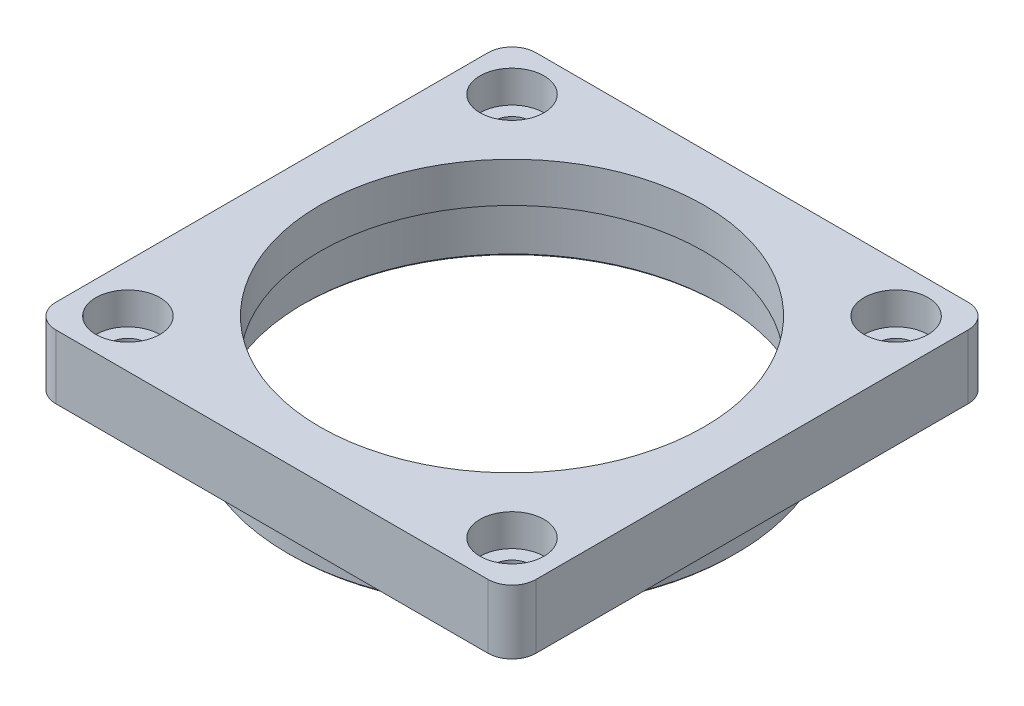
ISO-10303-21;
HEADER;
FILE_DESCRIPTION(('STEP AP214'),'2;1');
FILE_NAME('part.step','',(''),(''),'','','');
FILE_SCHEMA(('AUTOMOTIVE_DESIGN { 1 0 10303 214 1 1 1 1 }'));
ENDSEC;
DATA;
#1=APPLICATION_CONTEXT('core data for automotive mechanical design processes');
#2=APPLICATION_PROTOCOL_DEFINITION('international standard','automotive_design',2000,#1);
#3=PRODUCT_CONTEXT('',#1,'mechanical');
#4=PRODUCT('Part','Part','',(#3));
#5=PRODUCT_RELATED_PRODUCT_CATEGORY('part','',(#4));
#6=PRODUCT_DEFINITION_FORMATION('','',#4);
#7=PRODUCT_DEFINITION_CONTEXT('part definition',#1,'design');
#8=PRODUCT_DEFINITION('design','',#6,#7);
#9=PRODUCT_DEFINITION_SHAPE('','',#8);
#10=(LENGTH_UNIT() NAMED_UNIT(*) SI_UNIT(.MILLI.,.METRE.));
#11=(NAMED_UNIT(*) PLANE_ANGLE_UNIT() SI_UNIT($,.RADIAN.));
#12=(NAMED_UNIT(*) SI_UNIT($,.STERADIAN.) SOLID_ANGLE_UNIT());
#13=UNCERTAINTY_MEASURE_WITH_UNIT(LENGTH_MEASURE(1.E-05),#10,'distance_accuracy_value','');
#14=(GEOMETRIC_REPRESENTATION_CONTEXT(3) GLOBAL_UNCERTAINTY_ASSIGNED_CONTEXT((#13)) GLOBAL_UNIT_ASSIGNED_CONTEXT((#10,
#11,#12)) REPRESENTATION_CONTEXT('',''));
#15=CARTESIAN_POINT('',(0.,0.,0.));
#16=DIRECTION('',(0.,0.,1.));
#17=DIRECTION('',(1.,0.,0.));
#18=AXIS2_PLACEMENT_3D('',#15,#16,#17);
#19=CARTESIAN_POINT('',(-24.,8.,23.9999999999992));
#20=DIRECTION('',(0.,-1.,0.));
#21=DIRECTION('',(0.,0.,-1.));
#22=AXIS2_PLACEMENT_3D('',#19,#20,#21);
#23=CYLINDRICAL_SURFACE('',#22,2.24999999999989);
#24=CARTESIAN_POINT('',(-24.,0.,23.9999999999992));
#25=DIRECTION('',(0.,-1.,0.));
#26=DIRECTION('',(0.,0.,-1.));
#27=AXIS2_PLACEMENT_3D('',#24,#25,#26);
#28=CIRCLE('',#27,2.24999999999989);
#29=CARTESIAN_POINT('',(-24.,0.,21.7499999999993));
#30=VERTEX_POINT('',#29);
#31=EDGE_CURVE('E231',#30,#30,#28,.T.);
#32=ORIENTED_EDGE('',*,*,#31,.T.);
#33=EDGE_LOOP('',(#32));
#34=FACE_BOUND('',#33,.T.);
#35=CARTESIAN_POINT('',(-24.,4.,23.9999999999992));
#36=DIRECTION('',(0.,1.,0.));
#37=DIRECTION('',(0.,0.,1.));
#38=AXIS2_PLACEMENT_3D('',#35,#36,#37);
#39=CIRCLE('',#38,2.24999999999989);
#40=CARTESIAN_POINT('',(-24.,4.,26.2499999999991));
#41=VERTEX_POINT('',#40);
#42=EDGE_CURVE('E185',#41,#41,#39,.F.);
#43=ORIENTED_EDGE('',*,*,#42,.F.);
#44=EDGE_LOOP('',(#43));
#45=FACE_BOUND('',#44,.T.);
#46=ADVANCED_FACE('F41',(#34,#45),#23,.F.);
#47=CARTESIAN_POINT('',(24.,8.,24.0000000000012));
#48=DIRECTION('',(0.,-1.,0.));
#49=DIRECTION('',(0.,0.,-1.));
#50=AXIS2_PLACEMENT_3D('',#47,#48,#49);
#51=CYLINDRICAL_SURFACE('',#50,2.25);
#52=CARTESIAN_POINT('',(24.,0.,24.0000000000012));
#53=DIRECTION('',(0.,-1.,0.));
#54=DIRECTION('',(0.,0.,-1.));
#55=AXIS2_PLACEMENT_3D('',#52,#53,#54);
#56=CIRCLE('',#55,2.25);
#57=CARTESIAN_POINT('',(24.,0.,21.7500000000012));
#58=VERTEX_POINT('',#57);
#59=EDGE_CURVE('E228',#58,#58,#56,.T.);
#60=ORIENTED_EDGE('',*,*,#59,.T.);
#61=EDGE_LOOP('',(#60));
#62=FACE_BOUND('',#61,.T.);
#63=CARTESIAN_POINT('',(24.,4.,24.0000000000012));
#64=DIRECTION('',(0.,1.,0.));
#65=DIRECTION('',(0.,0.,1.));
#66=AXIS2_PLACEMENT_3D('',#63,#64,#65);
#67=CIRCLE('',#66,2.25);
#68=CARTESIAN_POINT('',(24.,4.,26.2500000000012));
#69=VERTEX_POINT('',#68);
#70=EDGE_CURVE('E182',#69,#69,#67,.F.);
#71=ORIENTED_EDGE('',*,*,#70,.F.);
#72=EDGE_LOOP('',(#71));
#73=FACE_BOUND('',#72,.T.);
#74=ADVANCED_FACE('F273',(#62,#73),#51,.F.);
#75=CARTESIAN_POINT('',(24.0000000000002,8.,-23.9999999999988));
#76=DIRECTION('',(0.,-1.,0.));
#77=DIRECTION('',(0.,0.,-1.));
#78=AXIS2_PLACEMENT_3D('',#75,#76,#77);
#79=CYLINDRICAL_SURFACE('',#78,2.25);
#80=CARTESIAN_POINT('',(24.0000000000002,0.,-23.9999999999988));
#81=DIRECTION('',(0.,-1.,0.));
#82=DIRECTION('',(0.,0.,-1.));
#83=AXIS2_PLACEMENT_3D('',#80,#81,#82);
#84=CIRCLE('',#83,2.25);
#85=CARTESIAN_POINT('',(24.0000000000002,0.,-26.2499999999988));
#86=VERTEX_POINT('',#85);
#87=EDGE_CURVE('E232',#86,#86,#84,.T.);
#88=ORIENTED_EDGE('',*,*,#87,.T.);
#89=EDGE_LOOP('',(#88));
#90=FACE_BOUND('',#89,.T.);
#91=CARTESIAN_POINT('',(24.0000000000002,4.,-23.9999999999988));
#92=DIRECTION('',(0.,1.,0.));
#93=DIRECTION('',(0.,0.,1.));
#94=AXIS2_PLACEMENT_3D('',#91,#92,#93);
#95=CIRCLE('',#94,2.25);
#96=CARTESIAN_POINT('',(24.0000000000002,4.,-21.7499999999988));
#97=VERTEX_POINT('',#96);
#98=EDGE_CURVE('E178',#97,#97,#95,.F.);
#99=ORIENTED_EDGE('',*,*,#98,.F.);
#100=EDGE_LOOP('',(#99));
#101=FACE_BOUND('',#100,.T.);
#102=ADVANCED_FACE('F279',(#90,#101),#79,.F.);
#103=CARTESIAN_POINT('',(-23.9999999999998,8.,-24.0000000000005));
#104=DIRECTION('',(0.,-1.,0.));
#105=DIRECTION('',(0.,0.,-1.));
#106=AXIS2_PLACEMENT_3D('',#103,#104,#105);
#107=CYLINDRICAL_SURFACE('',#106,2.25);
#108=CARTESIAN_POINT('',(-23.9999999999998,0.,-24.0000000000005));
#109=DIRECTION('',(0.,-1.,0.));
#110=DIRECTION('',(0.,0.,-1.));
#111=AXIS2_PLACEMENT_3D('',#108,#109,#110);
#112=CIRCLE('',#111,2.25);
#113=CARTESIAN_POINT('',(-23.9999999999998,0.,-26.2500000000005));
#114=VERTEX_POINT('',#113);
#115=EDGE_CURVE('E173',#114,#114,#112,.T.);
#116=ORIENTED_EDGE('',*,*,#115,.T.);
#117=EDGE_LOOP('',(#116));
#118=FACE_BOUND('',#117,.T.);
#119=CARTESIAN_POINT('',(-23.9999999999998,4.,-24.0000000000005));
#120=DIRECTION('',(0.,1.,0.));
#121=DIRECTION('',(0.,0.,1.));
#122=AXIS2_PLACEMENT_3D('',#119,#120,#121);
#123=CIRCLE('',#122,2.25);
#124=CARTESIAN_POINT('',(-23.9999999999998,4.,-21.7500000000005));
#125=VERTEX_POINT('',#124);
#126=EDGE_CURVE('E175',#125,#125,#123,.F.);
#127=ORIENTED_EDGE('',*,*,#126,.F.);
#128=EDGE_LOOP('',(#127));
#129=FACE_BOUND('',#128,.T.);
#130=ADVANCED_FACE('F284',(#118,#129),#107,.F.);
#131=CARTESIAN_POINT('',(0.,8.,0.));
#132=DIRECTION('',(0.,-1.,0.));
#133=DIRECTION('',(0.,0.,-1.));
#134=AXIS2_PLACEMENT_3D('',#131,#132,#133);
#135=CYLINDRICAL_SURFACE('',#134,24.);
#136=CARTESIAN_POINT('',(0.,8.,0.));
#137=DIRECTION('',(0.,1.,0.));
#138=DIRECTION('',(0.,0.,1.));
#139=AXIS2_PLACEMENT_3D('',#136,#137,#138);
#140=CIRCLE('',#139,24.);
#141=CARTESIAN_POINT('',(0.,8.,24.));
#142=VERTEX_POINT('',#141);
#143=EDGE_CURVE('E239',#142,#142,#140,.T.);
#144=ORIENTED_EDGE('',*,*,#143,.T.);
#145=EDGE_LOOP('',(#144));
#146=FACE_BOUND('',#145,.T.);
#147=CARTESIAN_POINT('',(0.,3.,0.));
#148=DIRECTION('',(0.,-1.,0.));
#149=DIRECTION('',(0.,0.,-1.));
#150=AXIS2_PLACEMENT_3D('',#147,#148,#149);
#151=CIRCLE('',#150,24.);
#152=CARTESIAN_POINT('',(0.,3.,-24.));
#153=VERTEX_POINT('',#152);
#154=EDGE_CURVE('E170',#153,#153,#151,.T.);
#155=ORIENTED_EDGE('',*,*,#154,.T.);
#156=EDGE_LOOP('',(#155));
#157=FACE_BOUND('',#156,.T.);
#158=ADVANCED_FACE('F289',(#146,#157),#135,.F.);
#159=CARTESIAN_POINT('',(0.,8.,0.));
#160=DIRECTION('',(0.,1.,0.));
#161=DIRECTION('',(0.,0.,1.));
#162=AXIS2_PLACEMENT_3D('',#159,#160,#161);
#163=PLANE('',#162);
#164=CARTESIAN_POINT('',(-23.9999999999987,8.,23.9999999999995));
#165=DIRECTION('',(0.,1.,0.));
#166=DIRECTION('',(0.,0.,1.));
#167=AXIS2_PLACEMENT_3D('',#164,#165,#166);
#168=CIRCLE('',#167,4.);
#169=CARTESIAN_POINT('',(-23.9999999999987,8.,27.9999999999995));
#170=VERTEX_POINT('',#169);
#171=EDGE_CURVE('E380',#170,#170,#168,.T.);
#172=ORIENTED_EDGE('',*,*,#171,.F.);
#173=EDGE_LOOP('',(#172));
#174=FACE_BOUND('',#173,.T.);
#175=CARTESIAN_POINT('',(24.0000000000013,8.,23.9999999999995));
#176=DIRECTION('',(0.,1.,0.));
#177=DIRECTION('',(0.,0.,1.));
#178=AXIS2_PLACEMENT_3D('',#175,#176,#177);
#179=CIRCLE('',#178,4.);
#180=CARTESIAN_POINT('',(24.0000000000013,8.,27.9999999999995));
#181=VERTEX_POINT('',#180);
#182=EDGE_CURVE('E374',#181,#181,#179,.T.);
#183=ORIENTED_EDGE('',*,*,#182,.F.);
#184=EDGE_LOOP('',(#183));
#185=FACE_BOUND('',#184,.T.);
#186=CARTESIAN_POINT('',(24.0000000000002,8.,-24.0000000000005));
#187=DIRECTION('',(0.,1.,0.));
#188=DIRECTION('',(0.,0.,1.));
#189=AXIS2_PLACEMENT_3D('',#186,#187,#188);
#190=CIRCLE('',#189,4.);
#191=CARTESIAN_POINT('',(24.0000000000002,8.,-20.0000000000005));
#192=VERTEX_POINT('',#191);
#193=EDGE_CURVE('E366',#192,#192,#190,.T.);
#194=ORIENTED_EDGE('',*,*,#193,.F.);
#195=EDGE_LOOP('',(#194));
#196=FACE_BOUND('',#195,.T.);
#197=CARTESIAN_POINT('',(-23.9999999999998,8.,-24.0000000000005));
#198=DIRECTION('',(0.,1.,0.));
#199=DIRECTION('',(0.,0.,1.));
#200=AXIS2_PLACEMENT_3D('',#197,#198,#199);
#201=CIRCLE('',#200,4.);
#202=CARTESIAN_POINT('',(-23.9999999999998,8.,-20.0000000000005));
#203=VERTEX_POINT('',#202);
#204=EDGE_CURVE('E226',#203,#203,#201,.T.);
#205=ORIENTED_EDGE('',*,*,#204,.F.);
#206=EDGE_LOOP('',(#205));
#207=FACE_BOUND('',#206,.T.);
#208=DIRECTION('',(0.,0.,1.));
#209=VECTOR('',#208,1.);
#210=CARTESIAN_POINT('',(-30.,8.,-30.));
#211=LINE('',#210,#209);
#212=CARTESIAN_POINT('',(-30.,8.,-27.));
#213=VERTEX_POINT('',#212);
#214=CARTESIAN_POINT('',(-30.,8.,27.));
#215=VERTEX_POINT('',#214);
#216=EDGE_CURVE('E246',#213,#215,#211,.T.);
#217=ORIENTED_EDGE('',*,*,#216,.T.);
#218=CARTESIAN_POINT('',(-27.,8.,27.));
#219=DIRECTION('',(0.,1.,0.));
#220=DIRECTION('',(0.,0.,1.));
#221=AXIS2_PLACEMENT_3D('',#218,#219,#220);
#222=CIRCLE('',#221,3.);
#223=CARTESIAN_POINT('',(-27.,8.,30.));
#224=VERTEX_POINT('',#223);
#225=EDGE_CURVE('E158',#215,#224,#222,.T.);
#226=ORIENTED_EDGE('',*,*,#225,.T.);
#227=DIRECTION('',(1.,0.,0.));
#228=VECTOR('',#227,1.);
#229=CARTESIAN_POINT('',(-30.,8.,30.));
#230=LINE('',#229,#228);
#231=CARTESIAN_POINT('',(27.,8.,30.));
#232=VERTEX_POINT('',#231);
#233=EDGE_CURVE('E129',#224,#232,#230,.T.);
#234=ORIENTED_EDGE('',*,*,#233,.T.);
#235=CARTESIAN_POINT('',(27.,8.,27.));
#236=DIRECTION('',(0.,1.,0.));
#237=DIRECTION('',(0.,0.,1.));
#238=AXIS2_PLACEMENT_3D('',#235,#236,#237);
#239=CIRCLE('',#238,3.);
#240=CARTESIAN_POINT('',(30.,8.,27.));
#241=VERTEX_POINT('',#240);
#242=EDGE_CURVE('E153',#232,#241,#239,.T.);
#243=ORIENTED_EDGE('',*,*,#242,.T.);
#244=DIRECTION('',(0.,0.,-1.));
#245=VECTOR('',#244,1.);
#246=CARTESIAN_POINT('',(30.,8.,-30.));
#247=LINE('',#246,#245);
#248=CARTESIAN_POINT('',(30.,8.,-27.));
#249=VERTEX_POINT('',#248);
#250=EDGE_CURVE('E135',#241,#249,#247,.T.);
#251=ORIENTED_EDGE('',*,*,#250,.T.);
#252=CARTESIAN_POINT('',(27.,8.,-27.));
#253=DIRECTION('',(0.,1.,0.));
#254=DIRECTION('',(0.,0.,1.));
#255=AXIS2_PLACEMENT_3D('',#252,#253,#254);
#256=CIRCLE('',#255,3.);
#257=CARTESIAN_POINT('',(27.,8.,-30.));
#258=VERTEX_POINT('',#257);
#259=EDGE_CURVE('E64',#249,#258,#256,.T.);
#260=ORIENTED_EDGE('',*,*,#259,.T.);
#261=DIRECTION('',(-1.,0.,0.));
#262=VECTOR('',#261,1.);
#263=CARTESIAN_POINT('',(-30.,8.,-30.));
#264=LINE('',#263,#262);
#265=CARTESIAN_POINT('',(-27.,8.,-30.));
#266=VERTEX_POINT('',#265);
#267=EDGE_CURVE('E138',#258,#266,#264,.T.);
#268=ORIENTED_EDGE('',*,*,#267,.T.);
#269=CARTESIAN_POINT('',(-27.,8.,-27.));
#270=DIRECTION('',(0.,1.,0.));
#271=DIRECTION('',(0.,0.,1.));
#272=AXIS2_PLACEMENT_3D('',#269,#270,#271);
#273=CIRCLE('',#272,3.);
#274=EDGE_CURVE('E156',#266,#213,#273,.T.);
#275=ORIENTED_EDGE('',*,*,#274,.T.);
#276=EDGE_LOOP('',(#217,#226,#234,#243,#251,#260,#268,#275));
#277=FACE_BOUND('',#276,.T.);
#278=ORIENTED_EDGE('',*,*,#143,.F.);
#279=EDGE_LOOP('',(#278));
#280=FACE_BOUND('',#279,.T.);
#281=ADVANCED_FACE('F259',(#174,#185,#196,#207,#277,#280),#163,.T.);
#282=CARTESIAN_POINT('',(0.,0.,0.));
#283=DIRECTION('',(0.,1.,0.));
#284=DIRECTION('',(0.,0.,1.));
#285=AXIS2_PLACEMENT_3D('',#282,#283,#284);
#286=PLANE('',#285);
#287=ORIENTED_EDGE('',*,*,#115,.F.);
#288=EDGE_LOOP('',(#287));
#289=FACE_BOUND('',#288,.T.);
#290=ORIENTED_EDGE('',*,*,#87,.F.);
#291=EDGE_LOOP('',(#290));
#292=FACE_BOUND('',#291,.T.);
#293=ORIENTED_EDGE('',*,*,#59,.F.);
#294=EDGE_LOOP('',(#293));
#295=FACE_BOUND('',#294,.T.);
#296=ORIENTED_EDGE('',*,*,#31,.F.);
#297=EDGE_LOOP('',(#296));
#298=FACE_BOUND('',#297,.T.);
#299=CARTESIAN_POINT('',(0.,0.,0.));
#300=DIRECTION('',(0.,-1.,0.));
#301=DIRECTION('',(0.,0.,-1.));
#302=AXIS2_PLACEMENT_3D('',#299,#300,#301);
#303=CIRCLE('',#302,28.);
#304=CARTESIAN_POINT('',(0.,0.,-28.));
#305=VERTEX_POINT('',#304);
#306=EDGE_CURVE('E144',#305,#305,#303,.T.);
#307=ORIENTED_EDGE('',*,*,#306,.F.);
#308=EDGE_LOOP('',(#307));
#309=FACE_BOUND('',#308,.T.);
#310=DIRECTION('',(1.,0.,0.));
#311=VECTOR('',#310,1.);
#312=CARTESIAN_POINT('',(-30.,0.,30.));
#313=LINE('',#312,#311);
#314=CARTESIAN_POINT('',(-27.,0.,30.));
#315=VERTEX_POINT('',#314);
#316=CARTESIAN_POINT('',(27.,0.,30.));
#317=VERTEX_POINT('',#316);
#318=EDGE_CURVE('E126',#315,#317,#313,.T.);
#319=ORIENTED_EDGE('',*,*,#318,.F.);
#320=CARTESIAN_POINT('',(-27.,0.,27.));
#321=DIRECTION('',(0.,1.,0.));
#322=DIRECTION('',(0.,0.,1.));
#323=AXIS2_PLACEMENT_3D('',#320,#321,#322);
#324=CIRCLE('',#323,3.);
#325=CARTESIAN_POINT('',(-30.,0.,27.));
#326=VERTEX_POINT('',#325);
#327=EDGE_CURVE('E109',#315,#326,#324,.F.);
#328=ORIENTED_EDGE('',*,*,#327,.T.);
#329=DIRECTION('',(0.,0.,1.));
#330=VECTOR('',#329,1.);
#331=CARTESIAN_POINT('',(-30.,0.,-30.));
#332=LINE('',#331,#330);
#333=CARTESIAN_POINT('',(-30.,0.,-27.));
#334=VERTEX_POINT('',#333);
#335=EDGE_CURVE('E136',#334,#326,#332,.T.);
#336=ORIENTED_EDGE('',*,*,#335,.F.);
#337=CARTESIAN_POINT('',(-27.,0.,-27.));
#338=DIRECTION('',(0.,1.,0.));
#339=DIRECTION('',(0.,0.,1.));
#340=AXIS2_PLACEMENT_3D('',#337,#338,#339);
#341=CIRCLE('',#340,3.);
#342=CARTESIAN_POINT('',(-27.,0.,-30.));
#343=VERTEX_POINT('',#342);
#344=EDGE_CURVE('E120',#334,#343,#341,.F.);
#345=ORIENTED_EDGE('',*,*,#344,.T.);
#346=DIRECTION('',(-1.,0.,0.));
#347=VECTOR('',#346,1.);
#348=CARTESIAN_POINT('',(-30.,0.,-30.));
#349=LINE('',#348,#347);
#350=CARTESIAN_POINT('',(27.,0.,-30.));
#351=VERTEX_POINT('',#350);
#352=EDGE_CURVE('E140',#351,#343,#349,.T.);
#353=ORIENTED_EDGE('',*,*,#352,.F.);
#354=CARTESIAN_POINT('',(27.,0.,-27.));
#355=DIRECTION('',(0.,1.,0.));
#356=DIRECTION('',(0.,0.,1.));
#357=AXIS2_PLACEMENT_3D('',#354,#355,#356);
#358=CIRCLE('',#357,3.);
#359=CARTESIAN_POINT('',(30.,0.,-27.));
#360=VERTEX_POINT('',#359);
#361=EDGE_CURVE('E147',#351,#360,#358,.F.);
#362=ORIENTED_EDGE('',*,*,#361,.T.);
#363=DIRECTION('',(0.,0.,-1.));
#364=VECTOR('',#363,1.);
#365=CARTESIAN_POINT('',(30.,0.,-30.));
#366=LINE('',#365,#364);
#367=CARTESIAN_POINT('',(30.,0.,27.));
#368=VERTEX_POINT('',#367);
#369=EDGE_CURVE('E243',#368,#360,#366,.T.);
#370=ORIENTED_EDGE('',*,*,#369,.F.);
#371=CARTESIAN_POINT('',(27.,0.,27.));
#372=DIRECTION('',(0.,1.,0.));
#373=DIRECTION('',(0.,0.,1.));
#374=AXIS2_PLACEMENT_3D('',#371,#372,#373);
#375=CIRCLE('',#374,3.);
#376=EDGE_CURVE('E130',#368,#317,#375,.F.);
#377=ORIENTED_EDGE('',*,*,#376,.T.);
#378=EDGE_LOOP('',(#319,#328,#336,#345,#353,#362,#370,#377));
#379=FACE_BOUND('',#378,.T.);
#380=ADVANCED_FACE('F133',(#289,#292,#295,#298,#309,#379),#286,.F.);
#381=CARTESIAN_POINT('',(30.,8.,-30.));
#382=DIRECTION('',(-1.,0.,0.));
#383=DIRECTION('',(0.,0.,1.));
#384=AXIS2_PLACEMENT_3D('',#381,#382,#383);
#385=PLANE('',#384);
#386=ORIENTED_EDGE('',*,*,#369,.T.);
#387=DIRECTION('',(0.,-1.,0.));
#388=VECTOR('',#387,1.);
#389=CARTESIAN_POINT('',(30.,8.,-27.));
#390=LINE('',#389,#388);
#391=EDGE_CURVE('E167',#360,#249,#390,.F.);
#392=ORIENTED_EDGE('',*,*,#391,.T.);
#393=ORIENTED_EDGE('',*,*,#250,.F.);
#394=DIRECTION('',(0.,-1.,0.));
#395=VECTOR('',#394,1.);
#396=CARTESIAN_POINT('',(30.,8.,27.));
#397=LINE('',#396,#395);
#398=EDGE_CURVE('E164',#241,#368,#397,.T.);
#399=ORIENTED_EDGE('',*,*,#398,.T.);
#400=EDGE_LOOP('',(#386,#392,#393,#399));
#401=FACE_BOUND('',#400,.T.);
#402=ADVANCED_FACE('F270',(#401),#385,.F.);
#403=CARTESIAN_POINT('',(-30.,8.,-30.));
#404=DIRECTION('',(0.,0.,1.));
#405=DIRECTION('',(1.,0.,0.));
#406=AXIS2_PLACEMENT_3D('',#403,#404,#405);
#407=PLANE('',#406);
#408=ORIENTED_EDGE('',*,*,#352,.T.);
#409=DIRECTION('',(0.,-1.,0.));
#410=VECTOR('',#409,1.);
#411=CARTESIAN_POINT('',(-27.,8.,-30.));
#412=LINE('',#411,#410);
#413=EDGE_CURVE('E57',#343,#266,#412,.F.);
#414=ORIENTED_EDGE('',*,*,#413,.T.);
#415=ORIENTED_EDGE('',*,*,#267,.F.);
#416=DIRECTION('',(0.,-1.,0.));
#417=VECTOR('',#416,1.);
#418=CARTESIAN_POINT('',(27.,8.,-30.));
#419=LINE('',#418,#417);
#420=EDGE_CURVE('E160',#258,#351,#419,.T.);
#421=ORIENTED_EDGE('',*,*,#420,.T.);
#422=EDGE_LOOP('',(#408,#414,#415,#421));
#423=FACE_BOUND('',#422,.T.);
#424=ADVANCED_FACE('F252',(#423),#407,.F.);
#425=CARTESIAN_POINT('',(-30.,8.,-30.));
#426=DIRECTION('',(1.,0.,0.));
#427=DIRECTION('',(0.,0.,-1.));
#428=AXIS2_PLACEMENT_3D('',#425,#426,#427);
#429=PLANE('',#428);
#430=ORIENTED_EDGE('',*,*,#335,.T.);
#431=DIRECTION('',(0.,-1.,0.));
#432=VECTOR('',#431,1.);
#433=CARTESIAN_POINT('',(-30.,8.,27.));
#434=LINE('',#433,#432);
#435=EDGE_CURVE('E114',#326,#215,#434,.F.);
#436=ORIENTED_EDGE('',*,*,#435,.T.);
#437=ORIENTED_EDGE('',*,*,#216,.F.);
#438=DIRECTION('',(0.,-1.,0.));
#439=VECTOR('',#438,1.);
#440=CARTESIAN_POINT('',(-30.,8.,-27.));
#441=LINE('',#440,#439);
#442=EDGE_CURVE('E119',#213,#334,#441,.T.);
#443=ORIENTED_EDGE('',*,*,#442,.T.);
#444=EDGE_LOOP('',(#430,#436,#437,#443));
#445=FACE_BOUND('',#444,.T.);
#446=ADVANCED_FACE('F262',(#445),#429,.F.);
#447=CARTESIAN_POINT('',(-30.,8.,30.));
#448=DIRECTION('',(0.,0.,-1.));
#449=DIRECTION('',(-1.,0.,0.));
#450=AXIS2_PLACEMENT_3D('',#447,#448,#449);
#451=PLANE('',#450);
#452=ORIENTED_EDGE('',*,*,#233,.F.);
#453=DIRECTION('',(0.,-1.,0.));
#454=VECTOR('',#453,1.);
#455=CARTESIAN_POINT('',(-27.,8.,30.));
#456=LINE('',#455,#454);
#457=EDGE_CURVE('E113',#224,#315,#456,.T.);
#458=ORIENTED_EDGE('',*,*,#457,.T.);
#459=ORIENTED_EDGE('',*,*,#318,.T.);
#460=DIRECTION('',(0.,-1.,0.));
#461=VECTOR('',#460,1.);
#462=CARTESIAN_POINT('',(27.,8.,30.));
#463=LINE('',#462,#461);
#464=EDGE_CURVE('E131',#317,#232,#463,.F.);
#465=ORIENTED_EDGE('',*,*,#464,.T.);
#466=EDGE_LOOP('',(#452,#458,#459,#465));
#467=FACE_BOUND('',#466,.T.);
#468=ADVANCED_FACE('F125',(#467),#451,.F.);
#469=CARTESIAN_POINT('',(0.,-4.,0.));
#470=DIRECTION('',(0.,-1.,0.));
#471=DIRECTION('',(0.,0.,-1.));
#472=AXIS2_PLACEMENT_3D('',#469,#470,#471);
#473=PLANE('',#472);
#474=CARTESIAN_POINT('',(0.,-4.,0.));
#475=DIRECTION('',(0.,-1.,0.));
#476=DIRECTION('',(0.,0.,-1.));
#477=AXIS2_PLACEMENT_3D('',#474,#475,#476);
#478=CIRCLE('',#477,27.7);
#479=CARTESIAN_POINT('',(0.,-4.,27.7));
#480=VERTEX_POINT('',#479);
#481=EDGE_CURVE('E190',#480,#480,#478,.T.);
#482=ORIENTED_EDGE('',*,*,#481,.T.);
#483=EDGE_LOOP('',(#482));
#484=FACE_BOUND('',#483,.T.);
#485=CARTESIAN_POINT('',(0.,-4.,0.));
#486=DIRECTION('',(0.,-1.,0.));
#487=DIRECTION('',(0.,0.,-1.));
#488=AXIS2_PLACEMENT_3D('',#485,#486,#487);
#489=CIRCLE('',#488,26.35);
#490=CARTESIAN_POINT('',(0.,-4.,-26.35));
#491=VERTEX_POINT('',#490);
#492=EDGE_CURVE('E169',#491,#491,#489,.F.);
#493=ORIENTED_EDGE('',*,*,#492,.T.);
#494=EDGE_LOOP('',(#493));
#495=FACE_BOUND('',#494,.T.);
#496=ADVANCED_FACE('F204',(#484,#495),#473,.T.);
#497=CARTESIAN_POINT('',(0.,-4.,0.));
#498=DIRECTION('',(0.,1.,0.));
#499=DIRECTION('',(0.,0.,1.));
#500=AXIS2_PLACEMENT_3D('',#497,#498,#499);
#501=CYLINDRICAL_SURFACE('',#500,28.);
#502=CARTESIAN_POINT('',(0.,-3.69999999999999,0.));
#503=DIRECTION('',(0.,-1.,0.));
#504=DIRECTION('',(0.,0.,-1.));
#505=AXIS2_PLACEMENT_3D('',#502,#503,#504);
#506=CIRCLE('',#505,28.);
#507=CARTESIAN_POINT('',(0.,-3.69999999999999,28.));
#508=VERTEX_POINT('',#507);
#509=EDGE_CURVE('E50',#508,#508,#506,.F.);
#510=ORIENTED_EDGE('',*,*,#509,.T.);
#511=EDGE_LOOP('',(#510));
#512=FACE_BOUND('',#511,.T.);
#513=ORIENTED_EDGE('',*,*,#306,.T.);
#514=EDGE_LOOP('',(#513));
#515=FACE_BOUND('',#514,.T.);
#516=ADVANCED_FACE('F195',(#512,#515),#501,.T.);
#517=CARTESIAN_POINT('',(-27.,8.,27.));
#518=DIRECTION('',(0.,-1.,0.));
#519=DIRECTION('',(0.,0.,-1.));
#520=AXIS2_PLACEMENT_3D('',#517,#518,#519);
#521=CYLINDRICAL_SURFACE('',#520,3.);
#522=ORIENTED_EDGE('',*,*,#225,.F.);
#523=ORIENTED_EDGE('',*,*,#435,.F.);
#524=ORIENTED_EDGE('',*,*,#327,.F.);
#525=ORIENTED_EDGE('',*,*,#457,.F.);
#526=EDGE_LOOP('',(#522,#523,#524,#525));
#527=FACE_BOUND('',#526,.T.);
#528=ADVANCED_FACE('F112',(#527),#521,.T.);
#529=CARTESIAN_POINT('',(-27.,8.,-27.));
#530=DIRECTION('',(0.,-1.,0.));
#531=DIRECTION('',(0.,0.,-1.));
#532=AXIS2_PLACEMENT_3D('',#529,#530,#531);
#533=CYLINDRICAL_SURFACE('',#532,3.);
#534=ORIENTED_EDGE('',*,*,#274,.F.);
#535=ORIENTED_EDGE('',*,*,#413,.F.);
#536=ORIENTED_EDGE('',*,*,#344,.F.);
#537=ORIENTED_EDGE('',*,*,#442,.F.);
#538=EDGE_LOOP('',(#534,#535,#536,#537));
#539=FACE_BOUND('',#538,.T.);
#540=ADVANCED_FACE('F256',(#539),#533,.T.);
#541=CARTESIAN_POINT('',(27.,8.,-27.));
#542=DIRECTION('',(0.,-1.,0.));
#543=DIRECTION('',(0.,0.,-1.));
#544=AXIS2_PLACEMENT_3D('',#541,#542,#543);
#545=CYLINDRICAL_SURFACE('',#544,3.);
#546=ORIENTED_EDGE('',*,*,#259,.F.);
#547=ORIENTED_EDGE('',*,*,#391,.F.);
#548=ORIENTED_EDGE('',*,*,#361,.F.);
#549=ORIENTED_EDGE('',*,*,#420,.F.);
#550=EDGE_LOOP('',(#546,#547,#548,#549));
#551=FACE_BOUND('',#550,.T.);
#552=ADVANCED_FACE('F546',(#551),#545,.T.);
#553=CARTESIAN_POINT('',(27.,8.,27.));
#554=DIRECTION('',(0.,-1.,0.));
#555=DIRECTION('',(0.,0.,-1.));
#556=AXIS2_PLACEMENT_3D('',#553,#554,#555);
#557=CYLINDRICAL_SURFACE('',#556,3.);
#558=ORIENTED_EDGE('',*,*,#242,.F.);
#559=ORIENTED_EDGE('',*,*,#464,.F.);
#560=ORIENTED_EDGE('',*,*,#376,.F.);
#561=ORIENTED_EDGE('',*,*,#398,.F.);
#562=EDGE_LOOP('',(#558,#559,#560,#561));
#563=FACE_BOUND('',#562,.T.);
#564=ADVANCED_FACE('F218',(#563),#557,.T.);
#565=CARTESIAN_POINT('',(0.,3.,0.));
#566=DIRECTION('',(0.,-1.,0.));
#567=DIRECTION('',(0.,0.,-1.));
#568=AXIS2_PLACEMENT_3D('',#565,#566,#567);
#569=CYLINDRICAL_SURFACE('',#568,26.05);
#570=CARTESIAN_POINT('',(0.,-3.70000000000002,0.));
#571=DIRECTION('',(0.,-1.,0.));
#572=DIRECTION('',(0.,0.,-1.));
#573=AXIS2_PLACEMENT_3D('',#570,#571,#572);
#574=CIRCLE('',#573,26.05);
#575=CARTESIAN_POINT('',(0.,-3.70000000000002,-26.05));
#576=VERTEX_POINT('',#575);
#577=EDGE_CURVE('E11',#576,#576,#574,.T.);
#578=ORIENTED_EDGE('',*,*,#577,.T.);
#579=EDGE_LOOP('',(#578));
#580=FACE_BOUND('',#579,.T.);
#581=CARTESIAN_POINT('',(0.,3.,0.));
#582=DIRECTION('',(0.,-1.,0.));
#583=DIRECTION('',(0.,0.,-1.));
#584=AXIS2_PLACEMENT_3D('',#581,#582,#583);
#585=CIRCLE('',#584,26.05);
#586=CARTESIAN_POINT('',(0.,3.,-26.05));
#587=VERTEX_POINT('',#586);
#588=EDGE_CURVE('E174',#587,#587,#585,.T.);
#589=ORIENTED_EDGE('',*,*,#588,.F.);
#590=EDGE_LOOP('',(#589));
#591=FACE_BOUND('',#590,.T.);
#592=ADVANCED_FACE('F214',(#580,#591),#569,.F.);
#593=CARTESIAN_POINT('',(0.,3.,0.));
#594=DIRECTION('',(0.,-1.,0.));
#595=DIRECTION('',(0.,0.,-1.));
#596=AXIS2_PLACEMENT_3D('',#593,#594,#595);
#597=PLANE('',#596);
#598=ORIENTED_EDGE('',*,*,#154,.F.);
#599=EDGE_LOOP('',(#598));
#600=FACE_BOUND('',#599,.T.);
#601=ORIENTED_EDGE('',*,*,#588,.T.);
#602=EDGE_LOOP('',(#601));
#603=FACE_BOUND('',#602,.T.);
#604=ADVANCED_FACE('F217',(#600,#603),#597,.T.);
#605=CARTESIAN_POINT('',(-23.9999999999998,4.,-24.0000000000005));
#606=DIRECTION('',(0.,1.,0.));
#607=DIRECTION('',(0.,0.,1.));
#608=AXIS2_PLACEMENT_3D('',#605,#606,#607);
#609=PLANE('',#608);
#610=CARTESIAN_POINT('',(-23.9999999999998,4.,-24.0000000000005));
#611=DIRECTION('',(0.,1.,0.));
#612=DIRECTION('',(0.,0.,1.));
#613=AXIS2_PLACEMENT_3D('',#610,#611,#612);
#614=CIRCLE('',#613,4.);
#615=CARTESIAN_POINT('',(-23.9999999999998,4.,-20.0000000000005));
#616=VERTEX_POINT('',#615);
#617=EDGE_CURVE('E179',#616,#616,#614,.T.);
#618=ORIENTED_EDGE('',*,*,#617,.T.);
#619=EDGE_LOOP('',(#618));
#620=FACE_BOUND('',#619,.T.);
#621=ORIENTED_EDGE('',*,*,#126,.T.);
#622=EDGE_LOOP('',(#621));
#623=FACE_BOUND('',#622,.T.);
#624=ADVANCED_FACE('F340',(#620,#623),#609,.T.);
#625=CARTESIAN_POINT('',(-23.9999999999998,4.,-24.0000000000005));
#626=DIRECTION('',(0.,1.,0.));
#627=DIRECTION('',(0.,0.,1.));
#628=AXIS2_PLACEMENT_3D('',#625,#626,#627);
#629=CYLINDRICAL_SURFACE('',#628,4.);
#630=ORIENTED_EDGE('',*,*,#617,.F.);
#631=EDGE_LOOP('',(#630));
#632=FACE_BOUND('',#631,.T.);
#633=ORIENTED_EDGE('',*,*,#204,.T.);
#634=EDGE_LOOP('',(#633));
#635=FACE_BOUND('',#634,.T.);
#636=ADVANCED_FACE('F343',(#632,#635),#629,.F.);
#637=CARTESIAN_POINT('',(24.0000000000002,4.,-24.0000000000005));
#638=DIRECTION('',(0.,1.,0.));
#639=DIRECTION('',(0.,0.,1.));
#640=AXIS2_PLACEMENT_3D('',#637,#638,#639);
#641=PLANE('',#640);
#642=CARTESIAN_POINT('',(24.0000000000002,4.,-24.0000000000005));
#643=DIRECTION('',(0.,1.,0.));
#644=DIRECTION('',(0.,0.,1.));
#645=AXIS2_PLACEMENT_3D('',#642,#643,#644);
#646=CIRCLE('',#645,4.);
#647=CARTESIAN_POINT('',(24.0000000000002,4.,-20.0000000000005));
#648=VERTEX_POINT('',#647);
#649=EDGE_CURVE('E365',#648,#648,#646,.T.);
#650=ORIENTED_EDGE('',*,*,#649,.T.);
#651=EDGE_LOOP('',(#650));
#652=FACE_BOUND('',#651,.T.);
#653=ORIENTED_EDGE('',*,*,#98,.T.);
#654=EDGE_LOOP('',(#653));
#655=FACE_BOUND('',#654,.T.);
#656=ADVANCED_FACE('F328',(#652,#655),#641,.T.);
#657=CARTESIAN_POINT('',(24.0000000000002,4.,-24.0000000000005));
#658=DIRECTION('',(0.,1.,0.));
#659=DIRECTION('',(0.,0.,1.));
#660=AXIS2_PLACEMENT_3D('',#657,#658,#659);
#661=CYLINDRICAL_SURFACE('',#660,4.);
#662=ORIENTED_EDGE('',*,*,#649,.F.);
#663=EDGE_LOOP('',(#662));
#664=FACE_BOUND('',#663,.T.);
#665=ORIENTED_EDGE('',*,*,#193,.T.);
#666=EDGE_LOOP('',(#665));
#667=FACE_BOUND('',#666,.T.);
#668=ADVANCED_FACE('F318',(#664,#667),#661,.F.);
#669=CARTESIAN_POINT('',(24.0000000000013,4.,23.9999999999995));
#670=DIRECTION('',(0.,1.,0.));
#671=DIRECTION('',(0.,0.,1.));
#672=AXIS2_PLACEMENT_3D('',#669,#670,#671);
#673=PLANE('',#672);
#674=CARTESIAN_POINT('',(24.0000000000013,4.,23.9999999999995));
#675=DIRECTION('',(0.,1.,0.));
#676=DIRECTION('',(0.,0.,1.));
#677=AXIS2_PLACEMENT_3D('',#674,#675,#676);
#678=CIRCLE('',#677,4.);
#679=CARTESIAN_POINT('',(24.0000000000013,4.,27.9999999999995));
#680=VERTEX_POINT('',#679);
#681=EDGE_CURVE('E370',#680,#680,#678,.T.);
#682=ORIENTED_EDGE('',*,*,#681,.T.);
#683=EDGE_LOOP('',(#682));
#684=FACE_BOUND('',#683,.T.);
#685=ORIENTED_EDGE('',*,*,#70,.T.);
#686=EDGE_LOOP('',(#685));
#687=FACE_BOUND('',#686,.T.);
#688=ADVANCED_FACE('F315',(#684,#687),#673,.T.);
#689=CARTESIAN_POINT('',(24.0000000000013,4.,23.9999999999995));
#690=DIRECTION('',(0.,1.,0.));
#691=DIRECTION('',(0.,0.,1.));
#692=AXIS2_PLACEMENT_3D('',#689,#690,#691);
#693=CYLINDRICAL_SURFACE('',#692,4.);
#694=ORIENTED_EDGE('',*,*,#681,.F.);
#695=EDGE_LOOP('',(#694));
#696=FACE_BOUND('',#695,.T.);
#697=ORIENTED_EDGE('',*,*,#182,.T.);
#698=EDGE_LOOP('',(#697));
#699=FACE_BOUND('',#698,.T.);
#700=ADVANCED_FACE('F317',(#696,#699),#693,.F.);
#701=CARTESIAN_POINT('',(-23.9999999999987,4.,23.9999999999995));
#702=DIRECTION('',(0.,1.,0.));
#703=DIRECTION('',(0.,0.,1.));
#704=AXIS2_PLACEMENT_3D('',#701,#702,#703);
#705=PLANE('',#704);
#706=CARTESIAN_POINT('',(-23.9999999999987,4.,23.9999999999995));
#707=DIRECTION('',(0.,1.,0.));
#708=DIRECTION('',(0.,0.,1.));
#709=AXIS2_PLACEMENT_3D('',#706,#707,#708);
#710=CIRCLE('',#709,4.);
#711=CARTESIAN_POINT('',(-23.9999999999987,4.,27.9999999999995));
#712=VERTEX_POINT('',#711);
#713=EDGE_CURVE('E377',#712,#712,#710,.T.);
#714=ORIENTED_EDGE('',*,*,#713,.T.);
#715=EDGE_LOOP('',(#714));
#716=FACE_BOUND('',#715,.T.);
#717=ORIENTED_EDGE('',*,*,#42,.T.);
#718=EDGE_LOOP('',(#717));
#719=FACE_BOUND('',#718,.T.);
#720=ADVANCED_FACE('F325',(#716,#719),#705,.T.);
#721=CARTESIAN_POINT('',(-23.9999999999987,4.,23.9999999999995));
#722=DIRECTION('',(0.,1.,0.));
#723=DIRECTION('',(0.,0.,1.));
#724=AXIS2_PLACEMENT_3D('',#721,#722,#723);
#725=CYLINDRICAL_SURFACE('',#724,4.);
#726=ORIENTED_EDGE('',*,*,#713,.F.);
#727=EDGE_LOOP('',(#726));
#728=FACE_BOUND('',#727,.T.);
#729=ORIENTED_EDGE('',*,*,#171,.T.);
#730=EDGE_LOOP('',(#729));
#731=FACE_BOUND('',#730,.T.);
#732=ADVANCED_FACE('F201',(#728,#731),#725,.F.);
#733=CARTESIAN_POINT('',(0.,-4.,0.));
#734=DIRECTION('',(0.,1.,0.));
#735=DIRECTION('',(0.,0.,1.));
#736=AXIS2_PLACEMENT_3D('',#733,#734,#735);
#737=CONICAL_SURFACE('',#736,27.7,0.78539816339746);
#738=CARTESIAN_POINT('',(0.,-3.69999999999999,28.));
#739=CARTESIAN_POINT('',(0.,-3.703125,27.996875));
#740=CARTESIAN_POINT('',(0.,-3.70624999999999,27.99375));
#741=CARTESIAN_POINT('',(0.,-3.7125,27.9875));
#742=CARTESIAN_POINT('',(0.,-3.71562499999999,27.984375));
#743=CARTESIAN_POINT('',(0.,-3.72187499999999,27.978125));
#744=CARTESIAN_POINT('',(0.,-3.725,27.975));
#745=CARTESIAN_POINT('',(0.,-3.73125,27.96875));
#746=CARTESIAN_POINT('',(0.,-3.734375,27.965625));
#747=CARTESIAN_POINT('',(0.,-3.74062499999999,27.959375));
#748=CARTESIAN_POINT('',(0.,-3.74375,27.95625));
#749=CARTESIAN_POINT('',(0.,-3.75,27.95));
#750=CARTESIAN_POINT('',(0.,-3.753125,27.946875));
#751=CARTESIAN_POINT('',(0.,-3.759375,27.940625));
#752=CARTESIAN_POINT('',(0.,-3.7625,27.9375));
#753=CARTESIAN_POINT('',(0.,-3.76875,27.93125));
#754=CARTESIAN_POINT('',(0.,-3.771875,27.928125));
#755=CARTESIAN_POINT('',(0.,-3.778125,27.921875));
#756=CARTESIAN_POINT('',(0.,-3.78125,27.91875));
#757=CARTESIAN_POINT('',(0.,-3.7875,27.9125));
#758=CARTESIAN_POINT('',(0.,-3.790625,27.909375));
#759=CARTESIAN_POINT('',(0.,-3.796875,27.903125));
#760=CARTESIAN_POINT('',(0.,-3.8,27.9));
#761=CARTESIAN_POINT('',(0.,-3.80625,27.89375));
#762=CARTESIAN_POINT('',(0.,-3.809375,27.890625));
#763=CARTESIAN_POINT('',(0.,-3.815625,27.884375));
#764=CARTESIAN_POINT('',(0.,-3.81875,27.88125));
#765=CARTESIAN_POINT('',(0.,-3.825,27.875));
#766=CARTESIAN_POINT('',(0.,-3.828125,27.871875));
#767=CARTESIAN_POINT('',(0.,-3.834375,27.865625));
#768=CARTESIAN_POINT('',(0.,-3.8375,27.8625));
#769=CARTESIAN_POINT('',(0.,-3.84375,27.85625));
#770=CARTESIAN_POINT('',(0.,-3.846875,27.853125));
#771=CARTESIAN_POINT('',(0.,-3.853125,27.846875));
#772=CARTESIAN_POINT('',(0.,-3.85625,27.84375));
#773=CARTESIAN_POINT('',(0.,-3.8625,27.8375));
#774=CARTESIAN_POINT('',(0.,-3.865625,27.834375));
#775=CARTESIAN_POINT('',(0.,-3.871875,27.828125));
#776=CARTESIAN_POINT('',(0.,-3.875,27.825));
#777=CARTESIAN_POINT('',(0.,-3.88125,27.81875));
#778=CARTESIAN_POINT('',(0.,-3.884375,27.815625));
#779=CARTESIAN_POINT('',(0.,-3.890625,27.809375));
#780=CARTESIAN_POINT('',(0.,-3.89375,27.80625));
#781=CARTESIAN_POINT('',(0.,-3.9,27.8));
#782=CARTESIAN_POINT('',(0.,-3.903125,27.796875));
#783=CARTESIAN_POINT('',(0.,-3.909375,27.790625));
#784=CARTESIAN_POINT('',(0.,-3.9125,27.7875));
#785=CARTESIAN_POINT('',(0.,-3.91875,27.78125));
#786=CARTESIAN_POINT('',(0.,-3.921875,27.778125));
#787=CARTESIAN_POINT('',(0.,-3.928125,27.771875));
#788=CARTESIAN_POINT('',(0.,-3.93125,27.76875));
#789=CARTESIAN_POINT('',(0.,-3.9375,27.7625));
#790=CARTESIAN_POINT('',(0.,-3.940625,27.759375));
#791=CARTESIAN_POINT('',(0.,-3.946875,27.753125));
#792=CARTESIAN_POINT('',(0.,-3.95,27.75));
#793=CARTESIAN_POINT('',(0.,-3.95625,27.74375));
#794=CARTESIAN_POINT('',(0.,-3.959375,27.740625));
#795=CARTESIAN_POINT('',(0.,-3.965625,27.734375));
#796=CARTESIAN_POINT('',(0.,-3.96875,27.73125));
#797=CARTESIAN_POINT('',(0.,-3.975,27.725));
#798=CARTESIAN_POINT('',(0.,-3.978125,27.721875));
#799=CARTESIAN_POINT('',(0.,-3.984375,27.715625));
#800=CARTESIAN_POINT('',(0.,-3.9875,27.7125));
#801=CARTESIAN_POINT('',(0.,-3.99375,27.70625));
#802=CARTESIAN_POINT('',(0.,-3.996875,27.703125));
#803=CARTESIAN_POINT('',(0.,-4.,27.7));
#804=B_SPLINE_CURVE_WITH_KNOTS('',3,(#738,#739,#740,#741,#742,#743,#744,#745,#746,#747,#748,
#749,#750,#751,#752,#753,#754,#755,#756,#757,#758,#759,#760,#761,#762,#763,#764,#765,#766,#767,
#768,#769,#770,#771,#772,#773,#774,#775,#776,#777,#778,#779,#780,#781,#782,#783,#784,#785,#786,
#787,#788,#789,#790,#791,#792,#793,#794,#795,#796,#797,#798,#799,#800,#801,#802,#803),
.UNSPECIFIED.,.F.,.F.,(4,2,2,2,2,2,2,2,2,2,2,2,2,2,2,2,2,2,2,2,2,2,2,2,2,2,2,2,2,2,2,2,4),(0.,
0.0132582521472472,0.0265165042944969,0.0397747564417441,0.0530330085889935,0.0662912607362407,
0.079549512883488,0.0928077650307373,0.106066017177985,0.119324269325234,0.132582521472481,
0.145840773619728,0.159099025766978,0.172357277914225,0.185615530061475,0.198873782208722,
0.212132034355969,0.225390286503219,0.238648538650466,0.251906790797715,0.265165042944963,
0.27842329509221,0.291681547239459,0.304939799386706,0.318198051533956,0.331456303681203,
0.34471455582845,0.3579728079757,0.371231060122947,0.384489312270197,0.397747564417444,
0.411005816564691,0.424264068711941),.UNSPECIFIED.);
#805=EDGE_CURVE('BSEAM198',#508,#480,#804,.T.);
#806=ORIENTED_EDGE('',*,*,#509,.F.);
#807=ORIENTED_EDGE('',*,*,#481,.F.);
#808=ORIENTED_EDGE('',*,*,#805,.T.);
#809=ORIENTED_EDGE('',*,*,#805,.F.);
#810=EDGE_LOOP('',(#806,#808,#807,#809));
#811=FACE_BOUND('',#810,.T.);
#812=ADVANCED_FACE('F198',(#811),#737,.T.);
#813=CARTESIAN_POINT('',(0.,-3.70000000000002,0.));
#814=DIRECTION('',(0.,-1.,0.));
#815=DIRECTION('',(0.,0.,-1.));
#816=AXIS2_PLACEMENT_3D('',#813,#814,#815);
#817=CONICAL_SURFACE('',#816,26.05,0.78539816339746);
#818=ORIENTED_EDGE('',*,*,#492,.F.);
#819=EDGE_LOOP('',(#818));
#820=FACE_BOUND('',#819,.T.);
#821=ORIENTED_EDGE('',*,*,#577,.F.);
#822=EDGE_LOOP('',(#821));
#823=FACE_BOUND('',#822,.T.);
#824=ADVANCED_FACE('F44',(#820,#823),#817,.F.);
#825=CLOSED_SHELL('',(#46,#74,#102,#130,#158,#281,#380,#402,#424,#446,#468,#496,#516,#528,#540,
#552,#564,#592,#604,#624,#636,#656,#668,#688,#700,#720,#732,#812,#824));
#826=MANIFOLD_SOLID_BREP('B2',#825);
#827=ADVANCED_BREP_SHAPE_REPRESENTATION('',(#18,#826),#14);
#828=SHAPE_DEFINITION_REPRESENTATION(#9,#827);
ENDSEC;
END-ISO-10303-21;
